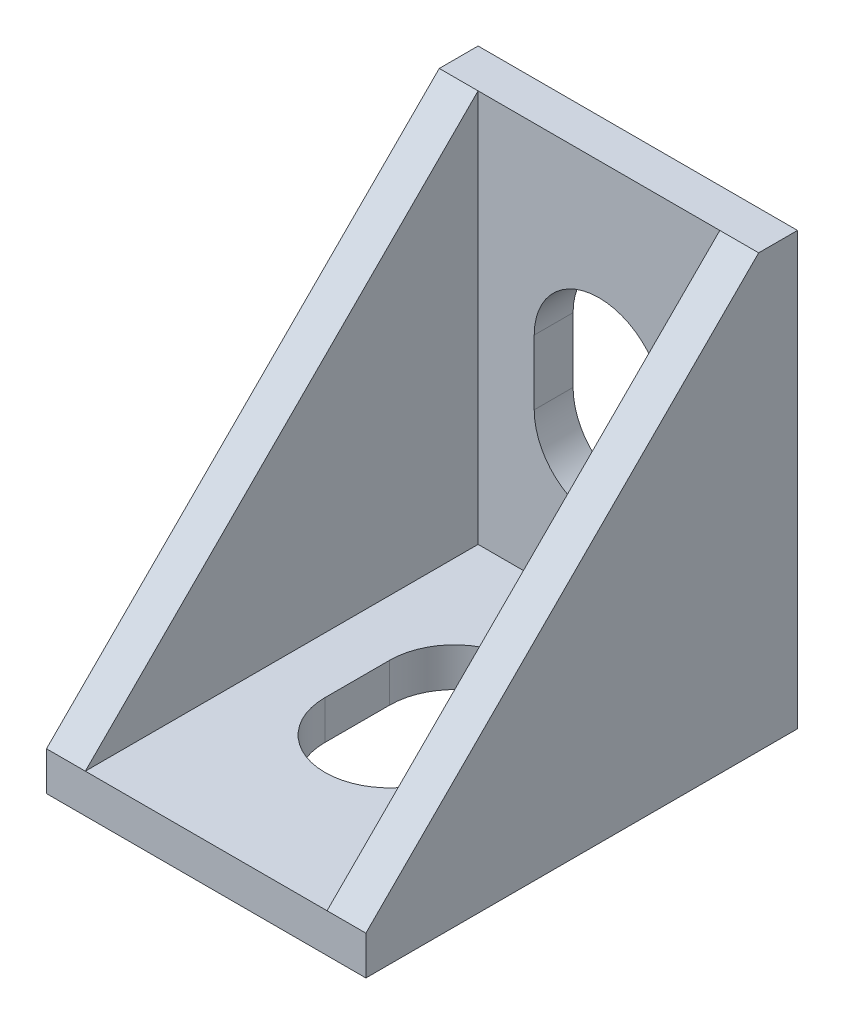
ISO-10303-21;
HEADER;
FILE_DESCRIPTION(('STEP AP214'),'2;1');
FILE_NAME('part.step','',(''),(''),'','','');
FILE_SCHEMA(('AUTOMOTIVE_DESIGN { 1 0 10303 214 1 1 1 1 }'));
ENDSEC;
DATA;
#1=APPLICATION_CONTEXT('core data for automotive mechanical design processes');
#2=APPLICATION_PROTOCOL_DEFINITION('international standard','automotive_design',2000,#1);
#3=PRODUCT_CONTEXT('',#1,'mechanical');
#4=PRODUCT('Part','Part','',(#3));
#5=PRODUCT_RELATED_PRODUCT_CATEGORY('part','',(#4));
#6=PRODUCT_DEFINITION_FORMATION('','',#4);
#7=PRODUCT_DEFINITION_CONTEXT('part definition',#1,'design');
#8=PRODUCT_DEFINITION('design','',#6,#7);
#9=PRODUCT_DEFINITION_SHAPE('','',#8);
#10=(LENGTH_UNIT() NAMED_UNIT(*) SI_UNIT(.MILLI.,.METRE.));
#11=(NAMED_UNIT(*) PLANE_ANGLE_UNIT() SI_UNIT($,.RADIAN.));
#12=(NAMED_UNIT(*) SI_UNIT($,.STERADIAN.) SOLID_ANGLE_UNIT());
#13=UNCERTAINTY_MEASURE_WITH_UNIT(LENGTH_MEASURE(1.E-05),#10,'distance_accuracy_value','');
#14=(GEOMETRIC_REPRESENTATION_CONTEXT(3) GLOBAL_UNCERTAINTY_ASSIGNED_CONTEXT((#13)) GLOBAL_UNIT_ASSIGNED_CONTEXT((#10,
#11,#12)) REPRESENTATION_CONTEXT('',''));
#15=CARTESIAN_POINT('',(0.,0.,0.));
#16=DIRECTION('',(0.,0.,1.));
#17=DIRECTION('',(1.,0.,0.));
#18=AXIS2_PLACEMENT_3D('',#15,#16,#17);
#19=CARTESIAN_POINT('',(0.,1.8,0.));
#20=DIRECTION('',(0.,1.,0.));
#21=DIRECTION('',(0.,0.,1.));
#22=AXIS2_PLACEMENT_3D('',#19,#20,#21);
#23=PLANE('',#22);
#24=DIRECTION('',(0.,0.,-1.));
#25=VECTOR('',#24,1.);
#26=CARTESIAN_POINT('',(13.,1.8,1.8));
#27=LINE('',#26,#25);
#28=CARTESIAN_POINT('',(13.,1.8,20.));
#29=VERTEX_POINT('',#28);
#30=CARTESIAN_POINT('',(13.,1.8,1.8));
#31=VERTEX_POINT('',#30);
#32=EDGE_CURVE('E149',#29,#31,#27,.T.);
#33=ORIENTED_EDGE('',*,*,#32,.T.);
#34=DIRECTION('',(1.,0.,0.));
#35=VECTOR('',#34,1.);
#36=CARTESIAN_POINT('',(0.,1.8,1.8));
#37=LINE('',#36,#35);
#38=CARTESIAN_POINT('',(1.8,1.8,1.8));
#39=VERTEX_POINT('',#38);
#40=EDGE_CURVE('E37',#39,#31,#37,.T.);
#41=ORIENTED_EDGE('',*,*,#40,.F.);
#42=DIRECTION('',(0.,0.,1.));
#43=VECTOR('',#42,1.);
#44=CARTESIAN_POINT('',(1.8,1.8,1.8));
#45=LINE('',#44,#43);
#46=CARTESIAN_POINT('',(1.8,1.8,20.));
#47=VERTEX_POINT('',#46);
#48=EDGE_CURVE('E180',#39,#47,#45,.T.);
#49=ORIENTED_EDGE('',*,*,#48,.T.);
#50=DIRECTION('',(1.,0.,0.));
#51=VECTOR('',#50,1.);
#52=CARTESIAN_POINT('',(0.,1.8,20.));
#53=LINE('',#52,#51);
#54=EDGE_CURVE('E175',#47,#29,#53,.T.);
#55=ORIENTED_EDGE('',*,*,#54,.T.);
#56=EDGE_LOOP('',(#33,#41,#49,#55));
#57=FACE_BOUND('',#56,.T.);
#58=CARTESIAN_POINT('',(7.4,1.8,11.5));
#59=DIRECTION('',(0.,1.,0.));
#60=DIRECTION('',(0.,0.,1.));
#61=AXIS2_PLACEMENT_3D('',#58,#59,#60);
#62=CIRCLE('',#61,3.);
#63=CARTESIAN_POINT('',(4.4,1.80000000000001,11.5));
#64=VERTEX_POINT('',#63);
#65=CARTESIAN_POINT('',(10.4,1.80000000000001,11.5));
#66=VERTEX_POINT('',#65);
#67=EDGE_CURVE('E266',#64,#66,#62,.T.);
#68=ORIENTED_EDGE('',*,*,#67,.F.);
#69=DIRECTION('',(0.,0.,1.));
#70=VECTOR('',#69,1.);
#71=CARTESIAN_POINT('',(4.4,1.8,0.));
#72=LINE('',#71,#70);
#73=CARTESIAN_POINT('',(4.4,1.8,8.5));
#74=VERTEX_POINT('',#73);
#75=EDGE_CURVE('E253',#74,#64,#72,.T.);
#76=ORIENTED_EDGE('',*,*,#75,.F.);
#77=CARTESIAN_POINT('',(7.4,1.8,8.5));
#78=DIRECTION('',(0.,1.,0.));
#79=DIRECTION('',(0.,0.,1.));
#80=AXIS2_PLACEMENT_3D('',#77,#78,#79);
#81=CIRCLE('',#80,3.);
#82=CARTESIAN_POINT('',(10.4,1.80000000000001,8.5));
#83=VERTEX_POINT('',#82);
#84=EDGE_CURVE('E261',#83,#74,#81,.T.);
#85=ORIENTED_EDGE('',*,*,#84,.F.);
#86=DIRECTION('',(0.,0.,-1.));
#87=VECTOR('',#86,1.);
#88=CARTESIAN_POINT('',(10.4,1.8,0.));
#89=LINE('',#88,#87);
#90=EDGE_CURVE('E264',#66,#83,#89,.T.);
#91=ORIENTED_EDGE('',*,*,#90,.F.);
#92=EDGE_LOOP('',(#68,#76,#85,#91));
#93=FACE_BOUND('',#92,.T.);
#94=ADVANCED_FACE('F33',(#57,#93),#23,.T.);
#95=CARTESIAN_POINT('',(0.,20.,1.8));
#96=DIRECTION('',(0.,0.,-1.));
#97=DIRECTION('',(-1.,0.,0.));
#98=AXIS2_PLACEMENT_3D('',#95,#96,#97);
#99=PLANE('',#98);
#100=DIRECTION('',(0.,1.,0.));
#101=VECTOR('',#100,1.);
#102=CARTESIAN_POINT('',(4.4,20.,1.8));
#103=LINE('',#102,#101);
#104=CARTESIAN_POINT('',(4.4,8.5,1.8));
#105=VERTEX_POINT('',#104);
#106=CARTESIAN_POINT('',(4.4,11.5,1.8));
#107=VERTEX_POINT('',#106);
#108=EDGE_CURVE('E43',#105,#107,#103,.T.);
#109=ORIENTED_EDGE('',*,*,#108,.T.);
#110=CARTESIAN_POINT('',(7.4,11.5,1.8));
#111=DIRECTION('',(0.,0.,-1.));
#112=DIRECTION('',(-1.,0.,0.));
#113=AXIS2_PLACEMENT_3D('',#110,#111,#112);
#114=CIRCLE('',#113,3.);
#115=CARTESIAN_POINT('',(10.4,11.5,1.8));
#116=VERTEX_POINT('',#115);
#117=EDGE_CURVE('E11',#107,#116,#114,.T.);
#118=ORIENTED_EDGE('',*,*,#117,.T.);
#119=DIRECTION('',(0.,-1.,0.));
#120=VECTOR('',#119,1.);
#121=CARTESIAN_POINT('',(10.4,20.,1.8));
#122=LINE('',#121,#120);
#123=CARTESIAN_POINT('',(10.4,8.5,1.8));
#124=VERTEX_POINT('',#123);
#125=EDGE_CURVE('E206',#116,#124,#122,.T.);
#126=ORIENTED_EDGE('',*,*,#125,.T.);
#127=CARTESIAN_POINT('',(7.4,8.5,1.8));
#128=DIRECTION('',(0.,0.,-1.));
#129=DIRECTION('',(-1.,0.,0.));
#130=AXIS2_PLACEMENT_3D('',#127,#128,#129);
#131=CIRCLE('',#130,3.);
#132=EDGE_CURVE('E209',#124,#105,#131,.T.);
#133=ORIENTED_EDGE('',*,*,#132,.T.);
#134=EDGE_LOOP('',(#109,#118,#126,#133));
#135=FACE_BOUND('',#134,.T.);
#136=ORIENTED_EDGE('',*,*,#40,.T.);
#137=DIRECTION('',(0.,1.,0.));
#138=VECTOR('',#137,1.);
#139=CARTESIAN_POINT('',(13.,20.,1.8));
#140=LINE('',#139,#138);
#141=CARTESIAN_POINT('',(13.,20.,1.8));
#142=VERTEX_POINT('',#141);
#143=EDGE_CURVE('E154',#31,#142,#140,.T.);
#144=ORIENTED_EDGE('',*,*,#143,.T.);
#145=DIRECTION('',(1.,0.,0.));
#146=VECTOR('',#145,1.);
#147=CARTESIAN_POINT('',(0.,20.,1.8));
#148=LINE('',#147,#146);
#149=CARTESIAN_POINT('',(1.8,20.,1.8));
#150=VERTEX_POINT('',#149);
#151=EDGE_CURVE('E271',#150,#142,#148,.T.);
#152=ORIENTED_EDGE('',*,*,#151,.F.);
#153=DIRECTION('',(0.,-1.,0.));
#154=VECTOR('',#153,1.);
#155=CARTESIAN_POINT('',(1.8,20.,1.8));
#156=LINE('',#155,#154);
#157=EDGE_CURVE('E290',#150,#39,#156,.T.);
#158=ORIENTED_EDGE('',*,*,#157,.T.);
#159=EDGE_LOOP('',(#136,#144,#152,#158));
#160=FACE_BOUND('',#159,.T.);
#161=ADVANCED_FACE('F214',(#135,#160),#99,.F.);
#162=CARTESIAN_POINT('',(0.,1.8,0.));
#163=DIRECTION('',(1.,0.,0.));
#164=DIRECTION('',(0.,0.,-1.));
#165=AXIS2_PLACEMENT_3D('',#162,#163,#164);
#166=PLANE('',#165);
#167=DIRECTION('',(0.,-1.,0.));
#168=VECTOR('',#167,1.);
#169=CARTESIAN_POINT('',(0.,1.8,20.));
#170=LINE('',#169,#168);
#171=CARTESIAN_POINT('',(0.,1.8,20.));
#172=VERTEX_POINT('',#171);
#173=CARTESIAN_POINT('',(0.,0.,20.));
#174=VERTEX_POINT('',#173);
#175=EDGE_CURVE('E203',#172,#174,#170,.T.);
#176=ORIENTED_EDGE('',*,*,#175,.F.);
#177=DIRECTION('',(0.,0.707106781186547,-0.707106781186548));
#178=VECTOR('',#177,1.);
#179=CARTESIAN_POINT('',(0.,1.8,20.));
#180=LINE('',#179,#178);
#181=CARTESIAN_POINT('',(0.,20.,1.8));
#182=VERTEX_POINT('',#181);
#183=EDGE_CURVE('E288',#172,#182,#180,.T.);
#184=ORIENTED_EDGE('',*,*,#183,.T.);
#185=DIRECTION('',(0.,0.,1.));
#186=VECTOR('',#185,1.);
#187=CARTESIAN_POINT('',(0.,20.,0.));
#188=LINE('',#187,#186);
#189=CARTESIAN_POINT('',(0.,20.,0.));
#190=VERTEX_POINT('',#189);
#191=EDGE_CURVE('E268',#190,#182,#188,.T.);
#192=ORIENTED_EDGE('',*,*,#191,.F.);
#193=DIRECTION('',(0.,-1.,0.));
#194=VECTOR('',#193,1.);
#195=CARTESIAN_POINT('',(0.,1.8,0.));
#196=LINE('',#195,#194);
#197=CARTESIAN_POINT('',(0.,0.,0.));
#198=VERTEX_POINT('',#197);
#199=EDGE_CURVE('E184',#190,#198,#196,.T.);
#200=ORIENTED_EDGE('',*,*,#199,.T.);
#201=DIRECTION('',(0.,0.,1.));
#202=VECTOR('',#201,1.);
#203=CARTESIAN_POINT('',(0.,0.,0.));
#204=LINE('',#203,#202);
#205=EDGE_CURVE('E191',#198,#174,#204,.T.);
#206=ORIENTED_EDGE('',*,*,#205,.T.);
#207=EDGE_LOOP('',(#176,#184,#192,#200,#206));
#208=FACE_BOUND('',#207,.T.);
#209=ADVANCED_FACE('F35',(#208),#166,.F.);
#210=CARTESIAN_POINT('',(0.,1.8,20.));
#211=DIRECTION('',(0.,0.,-1.));
#212=DIRECTION('',(-1.,0.,0.));
#213=AXIS2_PLACEMENT_3D('',#210,#211,#212);
#214=PLANE('',#213);
#215=DIRECTION('',(1.,0.,0.));
#216=VECTOR('',#215,1.);
#217=CARTESIAN_POINT('',(0.,0.,20.));
#218=LINE('',#217,#216);
#219=CARTESIAN_POINT('',(14.8,0.,20.));
#220=VERTEX_POINT('',#219);
#221=EDGE_CURVE('E194',#174,#220,#218,.T.);
#222=ORIENTED_EDGE('',*,*,#221,.T.);
#223=DIRECTION('',(0.,-1.,0.));
#224=VECTOR('',#223,1.);
#225=CARTESIAN_POINT('',(14.8,1.8,20.));
#226=LINE('',#225,#224);
#227=CARTESIAN_POINT('',(14.8,1.8,20.));
#228=VERTEX_POINT('',#227);
#229=EDGE_CURVE('E176',#228,#220,#226,.T.);
#230=ORIENTED_EDGE('',*,*,#229,.F.);
#231=DIRECTION('',(1.,0.,0.));
#232=VECTOR('',#231,1.);
#233=CARTESIAN_POINT('',(13.,1.8,20.));
#234=LINE('',#233,#232);
#235=EDGE_CURVE('E163',#29,#228,#234,.T.);
#236=ORIENTED_EDGE('',*,*,#235,.F.);
#237=ORIENTED_EDGE('',*,*,#54,.F.);
#238=EDGE_CURVE('E181',#172,#47,#53,.T.);
#239=ORIENTED_EDGE('',*,*,#238,.F.);
#240=ORIENTED_EDGE('',*,*,#175,.T.);
#241=EDGE_LOOP('',(#222,#230,#236,#237,#239,#240));
#242=FACE_BOUND('',#241,.T.);
#243=ADVANCED_FACE('F173',(#242),#214,.F.);
#244=CARTESIAN_POINT('',(14.8,1.8,0.));
#245=DIRECTION('',(1.,0.,0.));
#246=DIRECTION('',(0.,0.,-1.));
#247=AXIS2_PLACEMENT_3D('',#244,#245,#246);
#248=PLANE('',#247);
#249=DIRECTION('',(0.,0.,1.));
#250=VECTOR('',#249,1.);
#251=CARTESIAN_POINT('',(14.8,0.,0.));
#252=LINE('',#251,#250);
#253=CARTESIAN_POINT('',(14.8,0.,0.));
#254=VERTEX_POINT('',#253);
#255=EDGE_CURVE('E186',#254,#220,#252,.T.);
#256=ORIENTED_EDGE('',*,*,#255,.F.);
#257=DIRECTION('',(0.,-1.,0.));
#258=VECTOR('',#257,1.);
#259=CARTESIAN_POINT('',(14.8,1.8,0.));
#260=LINE('',#259,#258);
#261=CARTESIAN_POINT('',(14.8,20.,0.));
#262=VERTEX_POINT('',#261);
#263=EDGE_CURVE('E200',#262,#254,#260,.T.);
#264=ORIENTED_EDGE('',*,*,#263,.F.);
#265=DIRECTION('',(0.,0.,-1.));
#266=VECTOR('',#265,1.);
#267=CARTESIAN_POINT('',(14.8,20.,0.));
#268=LINE('',#267,#266);
#269=CARTESIAN_POINT('',(14.8,20.,1.8));
#270=VERTEX_POINT('',#269);
#271=EDGE_CURVE('E275',#270,#262,#268,.T.);
#272=ORIENTED_EDGE('',*,*,#271,.F.);
#273=DIRECTION('',(0.,-0.707106781186547,0.707106781186548));
#274=VECTOR('',#273,1.);
#275=CARTESIAN_POINT('',(14.8,1.8,20.));
#276=LINE('',#275,#274);
#277=EDGE_CURVE('E167',#270,#228,#276,.T.);
#278=ORIENTED_EDGE('',*,*,#277,.T.);
#279=ORIENTED_EDGE('',*,*,#229,.T.);
#280=EDGE_LOOP('',(#256,#264,#272,#278,#279));
#281=FACE_BOUND('',#280,.T.);
#282=ADVANCED_FACE('F334',(#281),#248,.T.);
#283=CARTESIAN_POINT('',(0.,1.8,0.));
#284=DIRECTION('',(0.,0.,-1.));
#285=DIRECTION('',(-1.,0.,0.));
#286=AXIS2_PLACEMENT_3D('',#283,#284,#285);
#287=PLANE('',#286);
#288=CARTESIAN_POINT('',(7.4,11.5,0.));
#289=DIRECTION('',(0.,0.,-1.));
#290=DIRECTION('',(-1.,0.,0.));
#291=AXIS2_PLACEMENT_3D('',#288,#289,#290);
#292=CIRCLE('',#291,3.);
#293=CARTESIAN_POINT('',(4.4,11.5,0.));
#294=VERTEX_POINT('',#293);
#295=CARTESIAN_POINT('',(10.4,11.5,0.));
#296=VERTEX_POINT('',#295);
#297=EDGE_CURVE('E58',#294,#296,#292,.T.);
#298=ORIENTED_EDGE('',*,*,#297,.F.);
#299=DIRECTION('',(0.,1.,0.));
#300=VECTOR('',#299,1.);
#301=CARTESIAN_POINT('',(4.4,11.5,0.));
#302=LINE('',#301,#300);
#303=CARTESIAN_POINT('',(4.4,8.5,0.));
#304=VERTEX_POINT('',#303);
#305=EDGE_CURVE('E239',#304,#294,#302,.T.);
#306=ORIENTED_EDGE('',*,*,#305,.F.);
#307=CARTESIAN_POINT('',(7.4,8.5,0.));
#308=DIRECTION('',(0.,0.,-1.));
#309=DIRECTION('',(-1.,0.,0.));
#310=AXIS2_PLACEMENT_3D('',#307,#308,#309);
#311=CIRCLE('',#310,3.);
#312=CARTESIAN_POINT('',(10.4,8.5,0.));
#313=VERTEX_POINT('',#312);
#314=EDGE_CURVE('E228',#313,#304,#311,.T.);
#315=ORIENTED_EDGE('',*,*,#314,.F.);
#316=DIRECTION('',(0.,-1.,0.));
#317=VECTOR('',#316,1.);
#318=CARTESIAN_POINT('',(10.4,11.5,0.));
#319=LINE('',#318,#317);
#320=EDGE_CURVE('E297',#296,#313,#319,.T.);
#321=ORIENTED_EDGE('',*,*,#320,.F.);
#322=EDGE_LOOP('',(#298,#306,#315,#321));
#323=FACE_BOUND('',#322,.T.);
#324=DIRECTION('',(1.,0.,0.));
#325=VECTOR('',#324,1.);
#326=CARTESIAN_POINT('',(0.,0.,0.));
#327=LINE('',#326,#325);
#328=EDGE_CURVE('E182',#198,#254,#327,.T.);
#329=ORIENTED_EDGE('',*,*,#328,.F.);
#330=ORIENTED_EDGE('',*,*,#199,.F.);
#331=DIRECTION('',(-1.,0.,0.));
#332=VECTOR('',#331,1.);
#333=CARTESIAN_POINT('',(0.,20.,0.));
#334=LINE('',#333,#332);
#335=EDGE_CURVE('E195',#262,#190,#334,.T.);
#336=ORIENTED_EDGE('',*,*,#335,.F.);
#337=ORIENTED_EDGE('',*,*,#263,.T.);
#338=EDGE_LOOP('',(#329,#330,#336,#337));
#339=FACE_BOUND('',#338,.T.);
#340=ADVANCED_FACE('F302',(#323,#339),#287,.T.);
#341=CARTESIAN_POINT('',(0.,0.,0.));
#342=DIRECTION('',(0.,1.,0.));
#343=DIRECTION('',(0.,0.,1.));
#344=AXIS2_PLACEMENT_3D('',#341,#342,#343);
#345=PLANE('',#344);
#346=DIRECTION('',(0.,0.,-1.));
#347=VECTOR('',#346,1.);
#348=CARTESIAN_POINT('',(4.4,0.,11.5));
#349=LINE('',#348,#347);
#350=CARTESIAN_POINT('',(4.4,0.,11.5));
#351=VERTEX_POINT('',#350);
#352=CARTESIAN_POINT('',(4.4,0.,8.5));
#353=VERTEX_POINT('',#352);
#354=EDGE_CURVE('E241',#351,#353,#349,.T.);
#355=ORIENTED_EDGE('',*,*,#354,.F.);
#356=CARTESIAN_POINT('',(7.4,0.,11.5));
#357=DIRECTION('',(0.,-1.,0.));
#358=DIRECTION('',(0.,0.,-1.));
#359=AXIS2_PLACEMENT_3D('',#356,#357,#358);
#360=CIRCLE('',#359,3.);
#361=CARTESIAN_POINT('',(10.4,0.,11.5));
#362=VERTEX_POINT('',#361);
#363=EDGE_CURVE('E232',#362,#351,#360,.T.);
#364=ORIENTED_EDGE('',*,*,#363,.F.);
#365=DIRECTION('',(0.,0.,1.));
#366=VECTOR('',#365,1.);
#367=CARTESIAN_POINT('',(10.4,0.,11.5));
#368=LINE('',#367,#366);
#369=CARTESIAN_POINT('',(10.4,0.,8.5));
#370=VERTEX_POINT('',#369);
#371=EDGE_CURVE('E247',#370,#362,#368,.T.);
#372=ORIENTED_EDGE('',*,*,#371,.F.);
#373=CARTESIAN_POINT('',(7.4,0.,8.5));
#374=DIRECTION('',(0.,-1.,0.));
#375=DIRECTION('',(0.,0.,-1.));
#376=AXIS2_PLACEMENT_3D('',#373,#374,#375);
#377=CIRCLE('',#376,3.);
#378=EDGE_CURVE('E244',#353,#370,#377,.T.);
#379=ORIENTED_EDGE('',*,*,#378,.F.);
#380=EDGE_LOOP('',(#355,#364,#372,#379));
#381=FACE_BOUND('',#380,.T.);
#382=ORIENTED_EDGE('',*,*,#205,.F.);
#383=ORIENTED_EDGE('',*,*,#328,.T.);
#384=ORIENTED_EDGE('',*,*,#255,.T.);
#385=ORIENTED_EDGE('',*,*,#221,.F.);
#386=EDGE_LOOP('',(#382,#383,#384,#385));
#387=FACE_BOUND('',#386,.T.);
#388=ADVANCED_FACE('F328',(#381,#387),#345,.F.);
#389=CARTESIAN_POINT('',(0.,20.,0.));
#390=DIRECTION('',(0.,1.,0.));
#391=DIRECTION('',(0.,0.,1.));
#392=AXIS2_PLACEMENT_3D('',#389,#390,#391);
#393=PLANE('',#392);
#394=ORIENTED_EDGE('',*,*,#191,.T.);
#395=EDGE_CURVE('E272',#182,#150,#148,.T.);
#396=ORIENTED_EDGE('',*,*,#395,.T.);
#397=ORIENTED_EDGE('',*,*,#151,.T.);
#398=DIRECTION('',(1.,0.,0.));
#399=VECTOR('',#398,1.);
#400=CARTESIAN_POINT('',(13.,20.,1.8));
#401=LINE('',#400,#399);
#402=EDGE_CURVE('E166',#142,#270,#401,.T.);
#403=ORIENTED_EDGE('',*,*,#402,.T.);
#404=ORIENTED_EDGE('',*,*,#271,.T.);
#405=ORIENTED_EDGE('',*,*,#335,.T.);
#406=EDGE_LOOP('',(#394,#396,#397,#403,#404,#405));
#407=FACE_BOUND('',#406,.T.);
#408=ADVANCED_FACE('F281',(#407),#393,.T.);
#409=CARTESIAN_POINT('',(7.4,20.000025,11.5));
#410=DIRECTION('',(0.,-1.,0.));
#411=DIRECTION('',(0.,0.,-1.));
#412=AXIS2_PLACEMENT_3D('',#409,#410,#411);
#413=CYLINDRICAL_SURFACE('',#412,3.);
#414=ORIENTED_EDGE('',*,*,#67,.T.);
#415=DIRECTION('',(0.,-1.,0.));
#416=VECTOR('',#415,1.);
#417=CARTESIAN_POINT('',(10.4,20.000025,11.5));
#418=LINE('',#417,#416);
#419=EDGE_CURVE('E251',#66,#362,#418,.T.);
#420=ORIENTED_EDGE('',*,*,#419,.T.);
#421=ORIENTED_EDGE('',*,*,#363,.T.);
#422=DIRECTION('',(0.,-1.,0.));
#423=VECTOR('',#422,1.);
#424=CARTESIAN_POINT('',(4.4,20.000025,11.5));
#425=LINE('',#424,#423);
#426=EDGE_CURVE('E250',#64,#351,#425,.T.);
#427=ORIENTED_EDGE('',*,*,#426,.F.);
#428=EDGE_LOOP('',(#414,#420,#421,#427));
#429=FACE_BOUND('',#428,.T.);
#430=ADVANCED_FACE('F450',(#429),#413,.F.);
#431=CARTESIAN_POINT('',(10.4,20.000025,11.5));
#432=DIRECTION('',(1.,0.,0.));
#433=DIRECTION('',(0.,0.,-1.));
#434=AXIS2_PLACEMENT_3D('',#431,#432,#433);
#435=PLANE('',#434);
#436=ORIENTED_EDGE('',*,*,#90,.T.);
#437=DIRECTION('',(0.,-1.,0.));
#438=VECTOR('',#437,1.);
#439=CARTESIAN_POINT('',(10.4,20.000025,8.5));
#440=LINE('',#439,#438);
#441=EDGE_CURVE('E254',#83,#370,#440,.T.);
#442=ORIENTED_EDGE('',*,*,#441,.T.);
#443=ORIENTED_EDGE('',*,*,#371,.T.);
#444=ORIENTED_EDGE('',*,*,#419,.F.);
#445=EDGE_LOOP('',(#436,#442,#443,#444));
#446=FACE_BOUND('',#445,.T.);
#447=ADVANCED_FACE('F441',(#446),#435,.F.);
#448=CARTESIAN_POINT('',(7.4,20.000025,8.5));
#449=DIRECTION('',(0.,-1.,0.));
#450=DIRECTION('',(0.,0.,-1.));
#451=AXIS2_PLACEMENT_3D('',#448,#449,#450);
#452=CYLINDRICAL_SURFACE('',#451,3.);
#453=ORIENTED_EDGE('',*,*,#84,.T.);
#454=DIRECTION('',(0.,-1.,0.));
#455=VECTOR('',#454,1.);
#456=CARTESIAN_POINT('',(4.4,20.000025,8.5));
#457=LINE('',#456,#455);
#458=EDGE_CURVE('E256',#74,#353,#457,.T.);
#459=ORIENTED_EDGE('',*,*,#458,.T.);
#460=ORIENTED_EDGE('',*,*,#378,.T.);
#461=ORIENTED_EDGE('',*,*,#441,.F.);
#462=EDGE_LOOP('',(#453,#459,#460,#461));
#463=FACE_BOUND('',#462,.T.);
#464=ADVANCED_FACE('F314',(#463),#452,.F.);
#465=CARTESIAN_POINT('',(4.4,20.000025,11.5));
#466=DIRECTION('',(-1.,0.,0.));
#467=DIRECTION('',(0.,0.,1.));
#468=AXIS2_PLACEMENT_3D('',#465,#466,#467);
#469=PLANE('',#468);
#470=ORIENTED_EDGE('',*,*,#75,.T.);
#471=ORIENTED_EDGE('',*,*,#426,.T.);
#472=ORIENTED_EDGE('',*,*,#354,.T.);
#473=ORIENTED_EDGE('',*,*,#458,.F.);
#474=EDGE_LOOP('',(#470,#471,#472,#473));
#475=FACE_BOUND('',#474,.T.);
#476=ADVANCED_FACE('F307',(#475),#469,.F.);
#477=CARTESIAN_POINT('',(7.4,11.5,17.2));
#478=DIRECTION('',(0.,0.,-1.));
#479=DIRECTION('',(-1.,0.,0.));
#480=AXIS2_PLACEMENT_3D('',#477,#478,#479);
#481=CYLINDRICAL_SURFACE('',#480,3.);
#482=DIRECTION('',(0.,0.,-1.));
#483=VECTOR('',#482,1.);
#484=CARTESIAN_POINT('',(4.4,11.5,17.2));
#485=LINE('',#484,#483);
#486=EDGE_CURVE('E224',#107,#294,#485,.T.);
#487=ORIENTED_EDGE('',*,*,#486,.T.);
#488=ORIENTED_EDGE('',*,*,#297,.T.);
#489=DIRECTION('',(0.,0.,-1.));
#490=VECTOR('',#489,1.);
#491=CARTESIAN_POINT('',(10.4,11.5,17.2));
#492=LINE('',#491,#490);
#493=EDGE_CURVE('E234',#116,#296,#492,.T.);
#494=ORIENTED_EDGE('',*,*,#493,.F.);
#495=ORIENTED_EDGE('',*,*,#117,.F.);
#496=EDGE_LOOP('',(#487,#488,#494,#495));
#497=FACE_BOUND('',#496,.T.);
#498=ADVANCED_FACE('F305',(#497),#481,.F.);
#499=CARTESIAN_POINT('',(4.4,11.5,17.2));
#500=DIRECTION('',(-1.,0.,0.));
#501=DIRECTION('',(0.,-1.,0.));
#502=AXIS2_PLACEMENT_3D('',#499,#500,#501);
#503=PLANE('',#502);
#504=DIRECTION('',(0.,0.,-1.));
#505=VECTOR('',#504,1.);
#506=CARTESIAN_POINT('',(4.4,8.5,17.2));
#507=LINE('',#506,#505);
#508=EDGE_CURVE('E222',#105,#304,#507,.T.);
#509=ORIENTED_EDGE('',*,*,#508,.T.);
#510=ORIENTED_EDGE('',*,*,#305,.T.);
#511=ORIENTED_EDGE('',*,*,#486,.F.);
#512=ORIENTED_EDGE('',*,*,#108,.F.);
#513=EDGE_LOOP('',(#509,#510,#511,#512));
#514=FACE_BOUND('',#513,.T.);
#515=ADVANCED_FACE('F220',(#514),#503,.F.);
#516=CARTESIAN_POINT('',(7.4,8.5,17.2));
#517=DIRECTION('',(0.,0.,-1.));
#518=DIRECTION('',(-1.,0.,0.));
#519=AXIS2_PLACEMENT_3D('',#516,#517,#518);
#520=CYLINDRICAL_SURFACE('',#519,3.);
#521=DIRECTION('',(0.,0.,-1.));
#522=VECTOR('',#521,1.);
#523=CARTESIAN_POINT('',(10.4,8.5,17.2));
#524=LINE('',#523,#522);
#525=EDGE_CURVE('E230',#124,#313,#524,.T.);
#526=ORIENTED_EDGE('',*,*,#525,.T.);
#527=ORIENTED_EDGE('',*,*,#314,.T.);
#528=ORIENTED_EDGE('',*,*,#508,.F.);
#529=ORIENTED_EDGE('',*,*,#132,.F.);
#530=EDGE_LOOP('',(#526,#527,#528,#529));
#531=FACE_BOUND('',#530,.T.);
#532=ADVANCED_FACE('F226',(#531),#520,.F.);
#533=CARTESIAN_POINT('',(10.4,11.5,17.2));
#534=DIRECTION('',(1.,0.,0.));
#535=DIRECTION('',(0.,1.,0.));
#536=AXIS2_PLACEMENT_3D('',#533,#534,#535);
#537=PLANE('',#536);
#538=ORIENTED_EDGE('',*,*,#493,.T.);
#539=ORIENTED_EDGE('',*,*,#320,.T.);
#540=ORIENTED_EDGE('',*,*,#525,.F.);
#541=ORIENTED_EDGE('',*,*,#125,.F.);
#542=EDGE_LOOP('',(#538,#539,#540,#541));
#543=FACE_BOUND('',#542,.T.);
#544=ADVANCED_FACE('F304',(#543),#537,.F.);
#545=CARTESIAN_POINT('',(1.8,1.8,20.));
#546=DIRECTION('',(0.,0.707106781186548,0.707106781186547));
#547=DIRECTION('',(0.,-0.707106781186547,0.707106781186548));
#548=AXIS2_PLACEMENT_3D('',#545,#546,#547);
#549=PLANE('',#548);
#550=ORIENTED_EDGE('',*,*,#183,.F.);
#551=ORIENTED_EDGE('',*,*,#238,.T.);
#552=DIRECTION('',(0.,0.707106781186547,-0.707106781186548));
#553=VECTOR('',#552,1.);
#554=CARTESIAN_POINT('',(1.8,1.8,20.));
#555=LINE('',#554,#553);
#556=EDGE_CURVE('E50',#47,#150,#555,.T.);
#557=ORIENTED_EDGE('',*,*,#556,.T.);
#558=ORIENTED_EDGE('',*,*,#395,.F.);
#559=EDGE_LOOP('',(#550,#551,#557,#558));
#560=FACE_BOUND('',#559,.T.);
#561=ADVANCED_FACE('F356',(#560),#549,.T.);
#562=CARTESIAN_POINT('',(1.8,0.,0.));
#563=DIRECTION('',(-1.,0.,0.));
#564=DIRECTION('',(0.,0.,1.));
#565=AXIS2_PLACEMENT_3D('',#562,#563,#564);
#566=PLANE('',#565);
#567=ORIENTED_EDGE('',*,*,#556,.F.);
#568=ORIENTED_EDGE('',*,*,#48,.F.);
#569=ORIENTED_EDGE('',*,*,#157,.F.);
#570=EDGE_LOOP('',(#567,#568,#569));
#571=FACE_BOUND('',#570,.T.);
#572=ADVANCED_FACE('F359',(#571),#566,.F.);
#573=CARTESIAN_POINT('',(13.,1.8,20.));
#574=DIRECTION('',(0.,0.707106781186548,0.707106781186547));
#575=DIRECTION('',(0.,-0.707106781186547,0.707106781186548));
#576=AXIS2_PLACEMENT_3D('',#573,#574,#575);
#577=PLANE('',#576);
#578=ORIENTED_EDGE('',*,*,#277,.F.);
#579=ORIENTED_EDGE('',*,*,#402,.F.);
#580=DIRECTION('',(0.,-0.707106781186547,0.707106781186548));
#581=VECTOR('',#580,1.);
#582=CARTESIAN_POINT('',(13.,1.8,20.));
#583=LINE('',#582,#581);
#584=EDGE_CURVE('E152',#142,#29,#583,.T.);
#585=ORIENTED_EDGE('',*,*,#584,.T.);
#586=ORIENTED_EDGE('',*,*,#235,.T.);
#587=EDGE_LOOP('',(#578,#579,#585,#586));
#588=FACE_BOUND('',#587,.T.);
#589=ADVANCED_FACE('F162',(#588),#577,.T.);
#590=CARTESIAN_POINT('',(13.,0.,0.));
#591=DIRECTION('',(-1.,0.,0.));
#592=DIRECTION('',(0.,0.,1.));
#593=AXIS2_PLACEMENT_3D('',#590,#591,#592);
#594=PLANE('',#593);
#595=ORIENTED_EDGE('',*,*,#584,.F.);
#596=ORIENTED_EDGE('',*,*,#143,.F.);
#597=ORIENTED_EDGE('',*,*,#32,.F.);
#598=EDGE_LOOP('',(#595,#596,#597));
#599=FACE_BOUND('',#598,.T.);
#600=ADVANCED_FACE('F151',(#599),#594,.T.);
#601=CLOSED_SHELL('',(#94,#161,#209,#243,#282,#340,#388,#408,#430,#447,#464,#476,#498,#515,#532,
#544,#561,#572,#589,#600));
#602=MANIFOLD_SOLID_BREP('B2',#601);
#603=ADVANCED_BREP_SHAPE_REPRESENTATION('',(#18,#602),#14);
#604=SHAPE_DEFINITION_REPRESENTATION(#9,#603);
ENDSEC;
END-ISO-10303-21;
